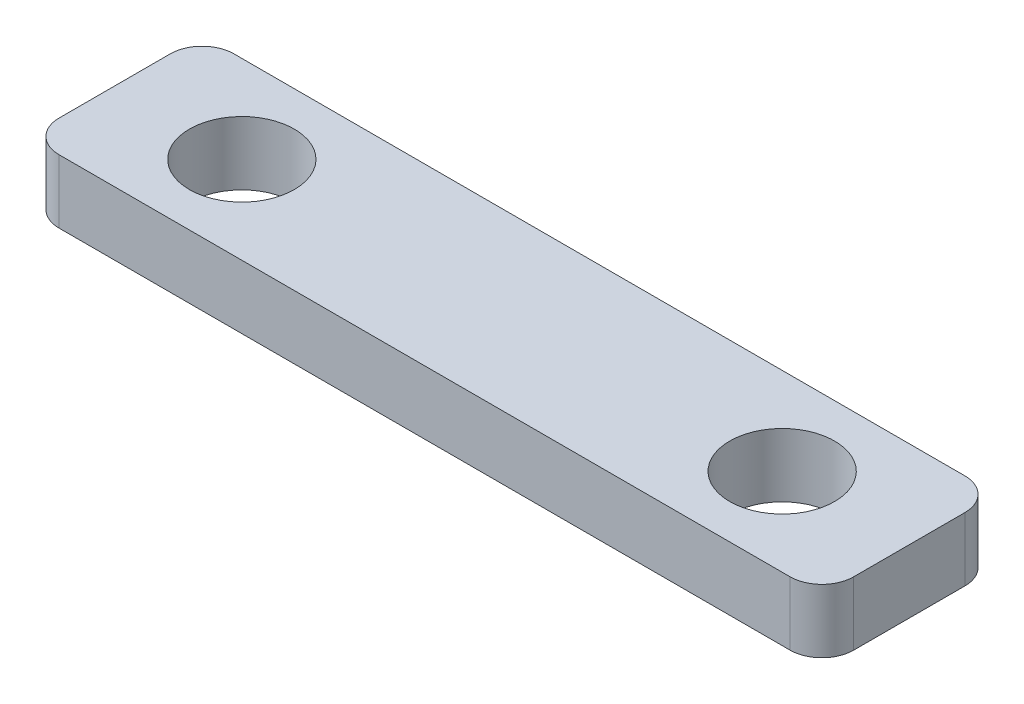
ISO-10303-21;
HEADER;
FILE_DESCRIPTION(('STEP AP214'),'2;1');
FILE_NAME('part.step','',(''),(''),'','','');
FILE_SCHEMA(('AUTOMOTIVE_DESIGN { 1 0 10303 214 1 1 1 1 }'));
ENDSEC;
DATA;
#1=APPLICATION_CONTEXT('core data for automotive mechanical design processes');
#2=APPLICATION_PROTOCOL_DEFINITION('international standard','automotive_design',2000,#1);
#3=PRODUCT_CONTEXT('',#1,'mechanical');
#4=PRODUCT('Part','Part','',(#3));
#5=PRODUCT_RELATED_PRODUCT_CATEGORY('part','',(#4));
#6=PRODUCT_DEFINITION_FORMATION('','',#4);
#7=PRODUCT_DEFINITION_CONTEXT('part definition',#1,'design');
#8=PRODUCT_DEFINITION('design','',#6,#7);
#9=PRODUCT_DEFINITION_SHAPE('','',#8);
#10=(LENGTH_UNIT() NAMED_UNIT(*) SI_UNIT(.MILLI.,.METRE.));
#11=(NAMED_UNIT(*) PLANE_ANGLE_UNIT() SI_UNIT($,.RADIAN.));
#12=(NAMED_UNIT(*) SI_UNIT($,.STERADIAN.) SOLID_ANGLE_UNIT());
#13=UNCERTAINTY_MEASURE_WITH_UNIT(LENGTH_MEASURE(1.E-05),#10,'distance_accuracy_value','');
#14=(GEOMETRIC_REPRESENTATION_CONTEXT(3) GLOBAL_UNCERTAINTY_ASSIGNED_CONTEXT((#13)) GLOBAL_UNIT_ASSIGNED_CONTEXT((#10,
#11,#12)) REPRESENTATION_CONTEXT('',''));
#15=CARTESIAN_POINT('',(0.,0.,0.));
#16=DIRECTION('',(0.,0.,1.));
#17=DIRECTION('',(1.,0.,0.));
#18=AXIS2_PLACEMENT_3D('',#15,#16,#17);
#19=CARTESIAN_POINT('',(0.,2.,0.));
#20=DIRECTION('',(0.,-1.,0.));
#21=DIRECTION('',(0.,0.,-1.));
#22=AXIS2_PLACEMENT_3D('',#19,#20,#21);
#23=PLANE('',#22);
#24=DIRECTION('',(-1.,0.,0.));
#25=VECTOR('',#24,1.);
#26=CARTESIAN_POINT('',(0.,2.,-5.5));
#27=LINE('',#26,#25);
#28=CARTESIAN_POINT('',(24.,2.,-5.5));
#29=VERTEX_POINT('',#28);
#30=CARTESIAN_POINT('',(0.999999999999999,2.,-5.5));
#31=VERTEX_POINT('',#30);
#32=EDGE_CURVE('E160',#29,#31,#27,.T.);
#33=ORIENTED_EDGE('',*,*,#32,.T.);
#34=CARTESIAN_POINT('',(0.999999999999999,2.,-4.5));
#35=DIRECTION('',(0.,-1.,0.));
#36=DIRECTION('',(0.,0.,-1.));
#37=AXIS2_PLACEMENT_3D('',#34,#35,#36);
#38=CIRCLE('',#37,1.);
#39=CARTESIAN_POINT('',(0.,2.,-4.5));
#40=VERTEX_POINT('',#39);
#41=EDGE_CURVE('E188',#31,#40,#38,.F.);
#42=ORIENTED_EDGE('',*,*,#41,.T.);
#43=DIRECTION('',(0.,0.,1.));
#44=VECTOR('',#43,1.);
#45=CARTESIAN_POINT('',(0.,2.,0.));
#46=LINE('',#45,#44);
#47=CARTESIAN_POINT('',(0.,2.,-1.));
#48=VERTEX_POINT('',#47);
#49=EDGE_CURVE('E137',#40,#48,#46,.T.);
#50=ORIENTED_EDGE('',*,*,#49,.T.);
#51=CARTESIAN_POINT('',(1.,2.,-1.));
#52=DIRECTION('',(0.,-1.,0.));
#53=DIRECTION('',(0.,0.,-1.));
#54=AXIS2_PLACEMENT_3D('',#51,#52,#53);
#55=CIRCLE('',#54,1.);
#56=CARTESIAN_POINT('',(1.,2.,0.));
#57=VERTEX_POINT('',#56);
#58=EDGE_CURVE('E180',#48,#57,#55,.F.);
#59=ORIENTED_EDGE('',*,*,#58,.T.);
#60=DIRECTION('',(1.,0.,0.));
#61=VECTOR('',#60,1.);
#62=CARTESIAN_POINT('',(0.,2.,0.));
#63=LINE('',#62,#61);
#64=CARTESIAN_POINT('',(24.,2.,0.));
#65=VERTEX_POINT('',#64);
#66=EDGE_CURVE('E203',#57,#65,#63,.T.);
#67=ORIENTED_EDGE('',*,*,#66,.T.);
#68=CARTESIAN_POINT('',(24.,2.,-1.));
#69=DIRECTION('',(0.,-1.,0.));
#70=DIRECTION('',(0.,0.,-1.));
#71=AXIS2_PLACEMENT_3D('',#68,#69,#70);
#72=CIRCLE('',#71,1.);
#73=CARTESIAN_POINT('',(25.,2.,-1.));
#74=VERTEX_POINT('',#73);
#75=EDGE_CURVE('E72',#65,#74,#72,.F.);
#76=ORIENTED_EDGE('',*,*,#75,.T.);
#77=DIRECTION('',(0.,0.,-1.));
#78=VECTOR('',#77,1.);
#79=CARTESIAN_POINT('',(25.,2.,0.));
#80=LINE('',#79,#78);
#81=CARTESIAN_POINT('',(25.,2.,-4.5));
#82=VERTEX_POINT('',#81);
#83=EDGE_CURVE('E211',#74,#82,#80,.T.);
#84=ORIENTED_EDGE('',*,*,#83,.T.);
#85=CARTESIAN_POINT('',(24.,2.,-4.5));
#86=DIRECTION('',(0.,-1.,0.));
#87=DIRECTION('',(0.,0.,-1.));
#88=AXIS2_PLACEMENT_3D('',#85,#86,#87);
#89=CIRCLE('',#88,1.);
#90=EDGE_CURVE('E185',#82,#29,#89,.F.);
#91=ORIENTED_EDGE('',*,*,#90,.T.);
#92=EDGE_LOOP('',(#33,#42,#50,#59,#67,#76,#84,#91));
#93=FACE_BOUND('',#92,.T.);
#94=CARTESIAN_POINT('',(4.,2.,-2.75));
#95=DIRECTION('',(0.,1.,0.));
#96=DIRECTION('',(0.,0.,1.));
#97=AXIS2_PLACEMENT_3D('',#94,#95,#96);
#98=CIRCLE('',#97,1.65);
#99=CARTESIAN_POINT('',(4.,2.,-1.1));
#100=VERTEX_POINT('',#99);
#101=EDGE_CURVE('E147',#100,#100,#98,.T.);
#102=ORIENTED_EDGE('',*,*,#101,.F.);
#103=EDGE_LOOP('',(#102));
#104=FACE_BOUND('',#103,.T.);
#105=CARTESIAN_POINT('',(21.,2.,-2.75));
#106=DIRECTION('',(0.,1.,0.));
#107=DIRECTION('',(0.,0.,1.));
#108=AXIS2_PLACEMENT_3D('',#105,#106,#107);
#109=CIRCLE('',#108,1.65);
#110=CARTESIAN_POINT('',(21.,2.,-1.1));
#111=VERTEX_POINT('',#110);
#112=EDGE_CURVE('E223',#111,#111,#109,.T.);
#113=ORIENTED_EDGE('',*,*,#112,.F.);
#114=EDGE_LOOP('',(#113));
#115=FACE_BOUND('',#114,.T.);
#116=ADVANCED_FACE('F49',(#93,#104,#115),#23,.F.);
#117=CARTESIAN_POINT('',(0.,0.,0.));
#118=DIRECTION('',(0.,-1.,0.));
#119=DIRECTION('',(0.,0.,-1.));
#120=AXIS2_PLACEMENT_3D('',#117,#118,#119);
#121=PLANE('',#120);
#122=CARTESIAN_POINT('',(4.,0.,-2.75));
#123=DIRECTION('',(0.,1.,0.));
#124=DIRECTION('',(0.,0.,1.));
#125=AXIS2_PLACEMENT_3D('',#122,#123,#124);
#126=CIRCLE('',#125,1.65);
#127=CARTESIAN_POINT('',(4.,0.,-1.1));
#128=VERTEX_POINT('',#127);
#129=EDGE_CURVE('E157',#128,#128,#126,.T.);
#130=ORIENTED_EDGE('',*,*,#129,.T.);
#131=EDGE_LOOP('',(#130));
#132=FACE_BOUND('',#131,.T.);
#133=DIRECTION('',(0.,0.,1.));
#134=VECTOR('',#133,1.);
#135=CARTESIAN_POINT('',(0.,0.,0.));
#136=LINE('',#135,#134);
#137=CARTESIAN_POINT('',(0.,0.,-4.5));
#138=VERTEX_POINT('',#137);
#139=CARTESIAN_POINT('',(0.,0.,-1.));
#140=VERTEX_POINT('',#139);
#141=EDGE_CURVE('E134',#138,#140,#136,.T.);
#142=ORIENTED_EDGE('',*,*,#141,.F.);
#143=CARTESIAN_POINT('',(0.999999999999999,0.,-4.5));
#144=DIRECTION('',(0.,-1.,0.));
#145=DIRECTION('',(0.,0.,-1.));
#146=AXIS2_PLACEMENT_3D('',#143,#144,#145);
#147=CIRCLE('',#146,1.);
#148=CARTESIAN_POINT('',(0.999999999999999,0.,-5.5));
#149=VERTEX_POINT('',#148);
#150=EDGE_CURVE('E116',#138,#149,#147,.T.);
#151=ORIENTED_EDGE('',*,*,#150,.T.);
#152=DIRECTION('',(-1.,0.,0.));
#153=VECTOR('',#152,1.);
#154=CARTESIAN_POINT('',(0.,0.,-5.5));
#155=LINE('',#154,#153);
#156=CARTESIAN_POINT('',(24.,0.,-5.5));
#157=VERTEX_POINT('',#156);
#158=EDGE_CURVE('E164',#157,#149,#155,.T.);
#159=ORIENTED_EDGE('',*,*,#158,.F.);
#160=CARTESIAN_POINT('',(24.,0.,-4.5));
#161=DIRECTION('',(0.,-1.,0.));
#162=DIRECTION('',(0.,0.,-1.));
#163=AXIS2_PLACEMENT_3D('',#160,#161,#162);
#164=CIRCLE('',#163,1.);
#165=CARTESIAN_POINT('',(25.,0.,-4.5));
#166=VERTEX_POINT('',#165);
#167=EDGE_CURVE('E128',#157,#166,#164,.T.);
#168=ORIENTED_EDGE('',*,*,#167,.T.);
#169=DIRECTION('',(0.,0.,-1.));
#170=VECTOR('',#169,1.);
#171=CARTESIAN_POINT('',(25.,0.,0.));
#172=LINE('',#171,#170);
#173=CARTESIAN_POINT('',(25.,0.,-1.));
#174=VERTEX_POINT('',#173);
#175=EDGE_CURVE('E153',#174,#166,#172,.T.);
#176=ORIENTED_EDGE('',*,*,#175,.F.);
#177=CARTESIAN_POINT('',(24.,0.,-1.));
#178=DIRECTION('',(0.,-1.,0.));
#179=DIRECTION('',(0.,0.,-1.));
#180=AXIS2_PLACEMENT_3D('',#177,#178,#179);
#181=CIRCLE('',#180,1.);
#182=CARTESIAN_POINT('',(24.,0.,0.));
#183=VERTEX_POINT('',#182);
#184=EDGE_CURVE('E170',#174,#183,#181,.T.);
#185=ORIENTED_EDGE('',*,*,#184,.T.);
#186=DIRECTION('',(1.,0.,0.));
#187=VECTOR('',#186,1.);
#188=CARTESIAN_POINT('',(0.,0.,0.));
#189=LINE('',#188,#187);
#190=CARTESIAN_POINT('',(1.,0.,0.));
#191=VERTEX_POINT('',#190);
#192=EDGE_CURVE('E146',#191,#183,#189,.T.);
#193=ORIENTED_EDGE('',*,*,#192,.F.);
#194=CARTESIAN_POINT('',(1.,0.,-1.));
#195=DIRECTION('',(0.,-1.,0.));
#196=DIRECTION('',(0.,0.,-1.));
#197=AXIS2_PLACEMENT_3D('',#194,#195,#196);
#198=CIRCLE('',#197,1.);
#199=EDGE_CURVE('E139',#191,#140,#198,.T.);
#200=ORIENTED_EDGE('',*,*,#199,.T.);
#201=EDGE_LOOP('',(#142,#151,#159,#168,#176,#185,#193,#200));
#202=FACE_BOUND('',#201,.T.);
#203=CARTESIAN_POINT('',(21.,0.,-2.75));
#204=DIRECTION('',(0.,1.,0.));
#205=DIRECTION('',(0.,0.,1.));
#206=AXIS2_PLACEMENT_3D('',#203,#204,#205);
#207=CIRCLE('',#206,1.65);
#208=CARTESIAN_POINT('',(21.,0.,-1.1));
#209=VERTEX_POINT('',#208);
#210=EDGE_CURVE('E225',#209,#209,#207,.T.);
#211=ORIENTED_EDGE('',*,*,#210,.T.);
#212=EDGE_LOOP('',(#211));
#213=FACE_BOUND('',#212,.T.);
#214=ADVANCED_FACE('F142',(#132,#202,#213),#121,.T.);
#215=CARTESIAN_POINT('',(0.,2.,0.));
#216=DIRECTION('',(1.,0.,0.));
#217=DIRECTION('',(0.,0.,-1.));
#218=AXIS2_PLACEMENT_3D('',#215,#216,#217);
#219=PLANE('',#218);
#220=ORIENTED_EDGE('',*,*,#49,.F.);
#221=DIRECTION('',(0.,-1.,0.));
#222=VECTOR('',#221,1.);
#223=CARTESIAN_POINT('',(0.,2.,-4.5));
#224=LINE('',#223,#222);
#225=EDGE_CURVE('E120',#40,#138,#224,.T.);
#226=ORIENTED_EDGE('',*,*,#225,.T.);
#227=ORIENTED_EDGE('',*,*,#141,.T.);
#228=DIRECTION('',(0.,-1.,0.));
#229=VECTOR('',#228,1.);
#230=CARTESIAN_POINT('',(0.,2.,-1.));
#231=LINE('',#230,#229);
#232=EDGE_CURVE('E140',#140,#48,#231,.F.);
#233=ORIENTED_EDGE('',*,*,#232,.T.);
#234=EDGE_LOOP('',(#220,#226,#227,#233));
#235=FACE_BOUND('',#234,.T.);
#236=ADVANCED_FACE('F133',(#235),#219,.F.);
#237=CARTESIAN_POINT('',(0.,2.,0.));
#238=DIRECTION('',(0.,0.,-1.));
#239=DIRECTION('',(-1.,0.,0.));
#240=AXIS2_PLACEMENT_3D('',#237,#238,#239);
#241=PLANE('',#240);
#242=ORIENTED_EDGE('',*,*,#192,.T.);
#243=DIRECTION('',(0.,-1.,0.));
#244=VECTOR('',#243,1.);
#245=CARTESIAN_POINT('',(24.,2.,0.));
#246=LINE('',#245,#244);
#247=EDGE_CURVE('E13',#183,#65,#246,.F.);
#248=ORIENTED_EDGE('',*,*,#247,.T.);
#249=ORIENTED_EDGE('',*,*,#66,.F.);
#250=DIRECTION('',(0.,-1.,0.));
#251=VECTOR('',#250,1.);
#252=CARTESIAN_POINT('',(1.,2.,0.));
#253=LINE('',#252,#251);
#254=EDGE_CURVE('E58',#57,#191,#253,.T.);
#255=ORIENTED_EDGE('',*,*,#254,.T.);
#256=EDGE_LOOP('',(#242,#248,#249,#255));
#257=FACE_BOUND('',#256,.T.);
#258=ADVANCED_FACE('F201',(#257),#241,.F.);
#259=CARTESIAN_POINT('',(25.,2.,0.));
#260=DIRECTION('',(-1.,0.,0.));
#261=DIRECTION('',(0.,0.,1.));
#262=AXIS2_PLACEMENT_3D('',#259,#260,#261);
#263=PLANE('',#262);
#264=ORIENTED_EDGE('',*,*,#175,.T.);
#265=DIRECTION('',(0.,-1.,0.));
#266=VECTOR('',#265,1.);
#267=CARTESIAN_POINT('',(25.,2.,-4.5));
#268=LINE('',#267,#266);
#269=EDGE_CURVE('E65',#166,#82,#268,.F.);
#270=ORIENTED_EDGE('',*,*,#269,.T.);
#271=ORIENTED_EDGE('',*,*,#83,.F.);
#272=DIRECTION('',(0.,-1.,0.));
#273=VECTOR('',#272,1.);
#274=CARTESIAN_POINT('',(25.,2.,-1.));
#275=LINE('',#274,#273);
#276=EDGE_CURVE('E191',#74,#174,#275,.T.);
#277=ORIENTED_EDGE('',*,*,#276,.T.);
#278=EDGE_LOOP('',(#264,#270,#271,#277));
#279=FACE_BOUND('',#278,.T.);
#280=ADVANCED_FACE('F210',(#279),#263,.F.);
#281=CARTESIAN_POINT('',(0.,2.,-5.5));
#282=DIRECTION('',(0.,0.,1.));
#283=DIRECTION('',(1.,0.,0.));
#284=AXIS2_PLACEMENT_3D('',#281,#282,#283);
#285=PLANE('',#284);
#286=ORIENTED_EDGE('',*,*,#158,.T.);
#287=DIRECTION('',(0.,-1.,0.));
#288=VECTOR('',#287,1.);
#289=CARTESIAN_POINT('',(0.999999999999999,2.,-5.5));
#290=LINE('',#289,#288);
#291=EDGE_CURVE('E121',#149,#31,#290,.F.);
#292=ORIENTED_EDGE('',*,*,#291,.T.);
#293=ORIENTED_EDGE('',*,*,#32,.F.);
#294=DIRECTION('',(0.,-1.,0.));
#295=VECTOR('',#294,1.);
#296=CARTESIAN_POINT('',(24.,2.,-5.5));
#297=LINE('',#296,#295);
#298=EDGE_CURVE('E127',#29,#157,#297,.T.);
#299=ORIENTED_EDGE('',*,*,#298,.T.);
#300=EDGE_LOOP('',(#286,#292,#293,#299));
#301=FACE_BOUND('',#300,.T.);
#302=ADVANCED_FACE('F248',(#301),#285,.F.);
#303=CARTESIAN_POINT('',(4.,2.,-2.75));
#304=DIRECTION('',(0.,-1.,0.));
#305=DIRECTION('',(0.,0.,-1.));
#306=AXIS2_PLACEMENT_3D('',#303,#304,#305);
#307=CYLINDRICAL_SURFACE('',#306,1.65);
#308=ORIENTED_EDGE('',*,*,#101,.T.);
#309=EDGE_LOOP('',(#308));
#310=FACE_BOUND('',#309,.T.);
#311=ORIENTED_EDGE('',*,*,#129,.F.);
#312=EDGE_LOOP('',(#311));
#313=FACE_BOUND('',#312,.T.);
#314=ADVANCED_FACE('F245',(#310,#313),#307,.F.);
#315=CARTESIAN_POINT('',(21.,2.,-2.75));
#316=DIRECTION('',(0.,-1.,0.));
#317=DIRECTION('',(0.,0.,-1.));
#318=AXIS2_PLACEMENT_3D('',#315,#316,#317);
#319=CYLINDRICAL_SURFACE('',#318,1.65);
#320=ORIENTED_EDGE('',*,*,#112,.T.);
#321=EDGE_LOOP('',(#320));
#322=FACE_BOUND('',#321,.T.);
#323=ORIENTED_EDGE('',*,*,#210,.F.);
#324=EDGE_LOOP('',(#323));
#325=FACE_BOUND('',#324,.T.);
#326=ADVANCED_FACE('F233',(#322,#325),#319,.F.);
#327=CARTESIAN_POINT('',(0.999999999999999,2.,-4.5));
#328=DIRECTION('',(0.,-1.,0.));
#329=DIRECTION('',(0.,0.,-1.));
#330=AXIS2_PLACEMENT_3D('',#327,#328,#329);
#331=CYLINDRICAL_SURFACE('',#330,1.);
#332=ORIENTED_EDGE('',*,*,#41,.F.);
#333=ORIENTED_EDGE('',*,*,#291,.F.);
#334=ORIENTED_EDGE('',*,*,#150,.F.);
#335=ORIENTED_EDGE('',*,*,#225,.F.);
#336=EDGE_LOOP('',(#332,#333,#334,#335));
#337=FACE_BOUND('',#336,.T.);
#338=ADVANCED_FACE('F119',(#337),#331,.T.);
#339=CARTESIAN_POINT('',(24.,2.,-4.5));
#340=DIRECTION('',(0.,-1.,0.));
#341=DIRECTION('',(0.,0.,-1.));
#342=AXIS2_PLACEMENT_3D('',#339,#340,#341);
#343=CYLINDRICAL_SURFACE('',#342,1.);
#344=ORIENTED_EDGE('',*,*,#90,.F.);
#345=ORIENTED_EDGE('',*,*,#269,.F.);
#346=ORIENTED_EDGE('',*,*,#167,.F.);
#347=ORIENTED_EDGE('',*,*,#298,.F.);
#348=EDGE_LOOP('',(#344,#345,#346,#347));
#349=FACE_BOUND('',#348,.T.);
#350=ADVANCED_FACE('F260',(#349),#343,.T.);
#351=CARTESIAN_POINT('',(24.,2.,-1.));
#352=DIRECTION('',(0.,-1.,0.));
#353=DIRECTION('',(0.,0.,-1.));
#354=AXIS2_PLACEMENT_3D('',#351,#352,#353);
#355=CYLINDRICAL_SURFACE('',#354,1.);
#356=ORIENTED_EDGE('',*,*,#75,.F.);
#357=ORIENTED_EDGE('',*,*,#247,.F.);
#358=ORIENTED_EDGE('',*,*,#184,.F.);
#359=ORIENTED_EDGE('',*,*,#276,.F.);
#360=EDGE_LOOP('',(#356,#357,#358,#359));
#361=FACE_BOUND('',#360,.T.);
#362=ADVANCED_FACE('F209',(#361),#355,.T.);
#363=CARTESIAN_POINT('',(1.,2.,-1.));
#364=DIRECTION('',(0.,-1.,0.));
#365=DIRECTION('',(0.,0.,-1.));
#366=AXIS2_PLACEMENT_3D('',#363,#364,#365);
#367=CYLINDRICAL_SURFACE('',#366,1.);
#368=ORIENTED_EDGE('',*,*,#58,.F.);
#369=ORIENTED_EDGE('',*,*,#232,.F.);
#370=ORIENTED_EDGE('',*,*,#199,.F.);
#371=ORIENTED_EDGE('',*,*,#254,.F.);
#372=EDGE_LOOP('',(#368,#369,#370,#371));
#373=FACE_BOUND('',#372,.T.);
#374=ADVANCED_FACE('F51',(#373),#367,.T.);
#375=CLOSED_SHELL('',(#116,#214,#236,#258,#280,#302,#314,#326,#338,#350,#362,#374));
#376=MANIFOLD_SOLID_BREP('B2',#375);
#377=ADVANCED_BREP_SHAPE_REPRESENTATION('',(#18,#376),#14);
#378=SHAPE_DEFINITION_REPRESENTATION(#9,#377);
ENDSEC;
END-ISO-10303-21;
